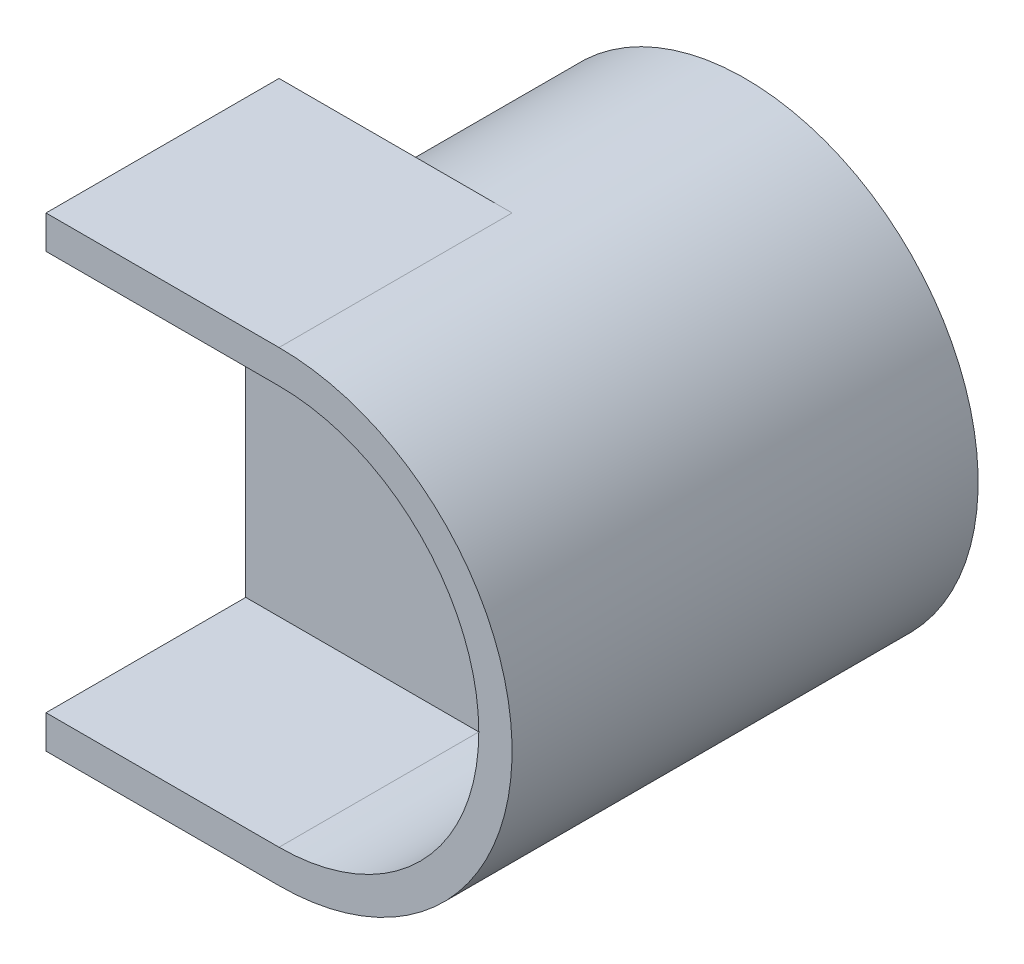
ISO-10303-21;
HEADER;
FILE_DESCRIPTION(('STEP AP214'),'2;1');
FILE_NAME('part.step','',(''),(''),'','','');
FILE_SCHEMA(('AUTOMOTIVE_DESIGN { 1 0 10303 214 1 1 1 1 }'));
ENDSEC;
DATA;
#1=APPLICATION_CONTEXT('core data for automotive mechanical design processes');
#2=APPLICATION_PROTOCOL_DEFINITION('international standard','automotive_design',2000,#1);
#3=PRODUCT_CONTEXT('',#1,'mechanical');
#4=PRODUCT('Part','Part','',(#3));
#5=PRODUCT_RELATED_PRODUCT_CATEGORY('part','',(#4));
#6=PRODUCT_DEFINITION_FORMATION('','',#4);
#7=PRODUCT_DEFINITION_CONTEXT('part definition',#1,'design');
#8=PRODUCT_DEFINITION('design','',#6,#7);
#9=PRODUCT_DEFINITION_SHAPE('','',#8);
#10=(LENGTH_UNIT() NAMED_UNIT(*) SI_UNIT(.MILLI.,.METRE.));
#11=(NAMED_UNIT(*) PLANE_ANGLE_UNIT() SI_UNIT($,.RADIAN.));
#12=(NAMED_UNIT(*) SI_UNIT($,.STERADIAN.) SOLID_ANGLE_UNIT());
#13=UNCERTAINTY_MEASURE_WITH_UNIT(LENGTH_MEASURE(1.E-05),#10,'distance_accuracy_value','');
#14=(GEOMETRIC_REPRESENTATION_CONTEXT(3) GLOBAL_UNCERTAINTY_ASSIGNED_CONTEXT((#13)) GLOBAL_UNIT_ASSIGNED_CONTEXT((#10,
#11,#12)) REPRESENTATION_CONTEXT('',''));
#15=CARTESIAN_POINT('',(0.,0.,0.));
#16=DIRECTION('',(0.,0.,1.));
#17=DIRECTION('',(1.,0.,0.));
#18=AXIS2_PLACEMENT_3D('',#15,#16,#17);
#19=CARTESIAN_POINT('',(0.,0.,-35.));
#20=DIRECTION('',(0.,0.,1.));
#21=DIRECTION('',(1.,0.,0.));
#22=AXIS2_PLACEMENT_3D('',#19,#20,#21);
#23=PLANE('',#22);
#24=DIRECTION('',(-1.,0.,0.));
#25=VECTOR('',#24,1.);
#26=CARTESIAN_POINT('',(35.,35.,-35.));
#27=LINE('',#26,#25);
#28=CARTESIAN_POINT('',(0.,35.,-35.));
#29=VERTEX_POINT('',#28);
#30=CARTESIAN_POINT('',(-35.,35.,-35.));
#31=VERTEX_POINT('',#30);
#32=EDGE_CURVE('E138',#29,#31,#27,.T.);
#33=ORIENTED_EDGE('',*,*,#32,.T.);
#34=DIRECTION('',(0.,-1.,0.));
#35=VECTOR('',#34,1.);
#36=CARTESIAN_POINT('',(-35.,-35.,-35.));
#37=LINE('',#36,#35);
#38=CARTESIAN_POINT('',(-35.,30.,-35.));
#39=VERTEX_POINT('',#38);
#40=EDGE_CURVE('E137',#31,#39,#37,.T.);
#41=ORIENTED_EDGE('',*,*,#40,.T.);
#42=DIRECTION('',(-1.,0.,0.));
#43=VECTOR('',#42,1.);
#44=CARTESIAN_POINT('',(35.,30.,-35.));
#45=LINE('',#44,#43);
#46=CARTESIAN_POINT('',(0.,30.,-35.));
#47=VERTEX_POINT('',#46);
#48=EDGE_CURVE('E65',#47,#39,#45,.T.);
#49=ORIENTED_EDGE('',*,*,#48,.F.);
#50=CARTESIAN_POINT('',(0.,0.,-35.));
#51=DIRECTION('',(0.,0.,1.));
#52=DIRECTION('',(1.,0.,0.));
#53=AXIS2_PLACEMENT_3D('',#50,#51,#52);
#54=CIRCLE('',#53,30.);
#55=CARTESIAN_POINT('',(0.,-30.,-35.));
#56=VERTEX_POINT('',#55);
#57=EDGE_CURVE('E143',#47,#56,#54,.F.);
#58=ORIENTED_EDGE('',*,*,#57,.T.);
#59=DIRECTION('',(1.,0.,0.));
#60=VECTOR('',#59,1.);
#61=CARTESIAN_POINT('',(0.,-30.,-35.));
#62=LINE('',#61,#60);
#63=CARTESIAN_POINT('',(-35.,-30.,-35.));
#64=VERTEX_POINT('',#63);
#65=EDGE_CURVE('E43',#56,#64,#62,.F.);
#66=ORIENTED_EDGE('',*,*,#65,.T.);
#67=CARTESIAN_POINT('',(-35.,-35.,-35.));
#68=VERTEX_POINT('',#67);
#69=EDGE_CURVE('E133',#64,#68,#37,.T.);
#70=ORIENTED_EDGE('',*,*,#69,.T.);
#71=DIRECTION('',(-1.,0.,0.));
#72=VECTOR('',#71,1.);
#73=CARTESIAN_POINT('',(35.,-35.,-35.));
#74=LINE('',#73,#72);
#75=CARTESIAN_POINT('',(0.,-35.,-35.));
#76=VERTEX_POINT('',#75);
#77=EDGE_CURVE('E88',#76,#68,#74,.T.);
#78=ORIENTED_EDGE('',*,*,#77,.F.);
#79=CARTESIAN_POINT('',(0.,0.,-35.));
#80=DIRECTION('',(0.,0.,1.));
#81=DIRECTION('',(1.,0.,0.));
#82=AXIS2_PLACEMENT_3D('',#79,#80,#81);
#83=CIRCLE('',#82,35.);
#84=EDGE_CURVE('E146',#29,#76,#83,.F.);
#85=ORIENTED_EDGE('',*,*,#84,.F.);
#86=EDGE_LOOP('',(#33,#41,#49,#58,#66,#70,#78,#85));
#87=FACE_BOUND('',#86,.T.);
#88=ADVANCED_FACE('F39',(#87),#23,.T.);
#89=CARTESIAN_POINT('',(0.,0.,-70.));
#90=DIRECTION('',(0.,0.,-1.));
#91=DIRECTION('',(-1.,0.,0.));
#92=AXIS2_PLACEMENT_3D('',#89,#90,#91);
#93=PLANE('',#92);
#94=CARTESIAN_POINT('',(0.,0.,-70.));
#95=DIRECTION('',(0.,0.,-1.));
#96=DIRECTION('',(-1.,0.,0.));
#97=AXIS2_PLACEMENT_3D('',#94,#95,#96);
#98=CIRCLE('',#97,17.5);
#99=CARTESIAN_POINT('',(-17.5,0.,-70.));
#100=VERTEX_POINT('',#99);
#101=EDGE_CURVE('E160',#100,#100,#98,.T.);
#102=ORIENTED_EDGE('',*,*,#101,.T.);
#103=EDGE_LOOP('',(#102));
#104=FACE_BOUND('',#103,.T.);
#105=ADVANCED_FACE('F230',(#104),#93,.T.);
#106=CARTESIAN_POINT('',(0.,0.,-105.));
#107=DIRECTION('',(0.,0.,1.));
#108=DIRECTION('',(1.,0.,0.));
#109=AXIS2_PLACEMENT_3D('',#106,#107,#108);
#110=CYLINDRICAL_SURFACE('',#109,17.5);
#111=CARTESIAN_POINT('',(0.,0.,-105.));
#112=DIRECTION('',(0.,0.,-1.));
#113=DIRECTION('',(-1.,0.,0.));
#114=AXIS2_PLACEMENT_3D('',#111,#112,#113);
#115=CIRCLE('',#114,17.5);
#116=CARTESIAN_POINT('',(-17.5,0.,-105.));
#117=VERTEX_POINT('',#116);
#118=EDGE_CURVE('E161',#117,#117,#115,.T.);
#119=ORIENTED_EDGE('',*,*,#118,.T.);
#120=EDGE_LOOP('',(#119));
#121=FACE_BOUND('',#120,.T.);
#122=ORIENTED_EDGE('',*,*,#101,.F.);
#123=EDGE_LOOP('',(#122));
#124=FACE_BOUND('',#123,.T.);
#125=ADVANCED_FACE('F232',(#121,#124),#110,.F.);
#126=CARTESIAN_POINT('',(6.19008791971696,-20.7170735549877,0.001000000000001));
#127=DIRECTION('',(0.,0.,-1.));
#128=DIRECTION('',(-1.,0.,0.));
#129=AXIS2_PLACEMENT_3D('',#126,#127,#128);
#130=CYLINDRICAL_SURFACE('',#129,2.5);
#131=CARTESIAN_POINT('',(6.19008791971696,-20.7170735549877,-65.));
#132=DIRECTION('',(0.,0.,-1.));
#133=DIRECTION('',(-1.,0.,0.));
#134=AXIS2_PLACEMENT_3D('',#131,#132,#133);
#135=CIRCLE('',#134,2.5);
#136=CARTESIAN_POINT('',(3.69008791971696,-20.7170735549877,-65.));
#137=VERTEX_POINT('',#136);
#138=EDGE_CURVE('E170',#137,#137,#135,.T.);
#139=ORIENTED_EDGE('',*,*,#138,.F.);
#140=EDGE_LOOP('',(#139));
#141=FACE_BOUND('',#140,.T.);
#142=CARTESIAN_POINT('',(6.19008791971696,-20.7170735549877,-105.));
#143=DIRECTION('',(0.,0.,-1.));
#144=DIRECTION('',(-1.,0.,0.));
#145=AXIS2_PLACEMENT_3D('',#142,#143,#144);
#146=CIRCLE('',#145,2.5);
#147=CARTESIAN_POINT('',(3.69008791971696,-20.7170735549877,-105.));
#148=VERTEX_POINT('',#147);
#149=EDGE_CURVE('E11',#148,#148,#146,.T.);
#150=ORIENTED_EDGE('',*,*,#149,.T.);
#151=EDGE_LOOP('',(#150));
#152=FACE_BOUND('',#151,.T.);
#153=ADVANCED_FACE('F41',(#141,#152),#130,.F.);
#154=CARTESIAN_POINT('',(21.5544566211452,-4.27973269928448,0.001000000000001));
#155=DIRECTION('',(0.,0.,-1.));
#156=DIRECTION('',(-1.,0.,0.));
#157=AXIS2_PLACEMENT_3D('',#154,#155,#156);
#158=CYLINDRICAL_SURFACE('',#157,2.5);
#159=CARTESIAN_POINT('',(21.5544566211452,-4.27973269928448,-65.));
#160=DIRECTION('',(0.,0.,-1.));
#161=DIRECTION('',(-1.,0.,0.));
#162=AXIS2_PLACEMENT_3D('',#159,#160,#161);
#163=CIRCLE('',#162,2.5);
#164=CARTESIAN_POINT('',(19.0544566211452,-4.27973269928448,-65.));
#165=VERTEX_POINT('',#164);
#166=EDGE_CURVE('E175',#165,#165,#163,.T.);
#167=ORIENTED_EDGE('',*,*,#166,.F.);
#168=EDGE_LOOP('',(#167));
#169=FACE_BOUND('',#168,.T.);
#170=CARTESIAN_POINT('',(21.5544566211452,-4.27973269928448,-105.));
#171=DIRECTION('',(0.,0.,-1.));
#172=DIRECTION('',(-1.,0.,0.));
#173=AXIS2_PLACEMENT_3D('',#170,#171,#172);
#174=CIRCLE('',#173,2.5);
#175=CARTESIAN_POINT('',(19.0544566211452,-4.27973269928448,-105.));
#176=VERTEX_POINT('',#175);
#177=EDGE_CURVE('E48',#176,#176,#174,.T.);
#178=ORIENTED_EDGE('',*,*,#177,.T.);
#179=EDGE_LOOP('',(#178));
#180=FACE_BOUND('',#179,.T.);
#181=ADVANCED_FACE('F263',(#169,#180),#158,.F.);
#182=CARTESIAN_POINT('',(15.0014862201565,17.2448713371146,0.001000000000001));
#183=DIRECTION('',(0.,0.,-1.));
#184=DIRECTION('',(-1.,0.,0.));
#185=AXIS2_PLACEMENT_3D('',#182,#183,#184);
#186=CYLINDRICAL_SURFACE('',#185,2.5);
#187=CARTESIAN_POINT('',(15.0014862201565,17.2448713371146,-65.));
#188=DIRECTION('',(0.,0.,-1.));
#189=DIRECTION('',(-1.,0.,0.));
#190=AXIS2_PLACEMENT_3D('',#187,#188,#189);
#191=CIRCLE('',#190,2.5);
#192=CARTESIAN_POINT('',(12.5014862201565,17.2448713371146,-65.));
#193=VERTEX_POINT('',#192);
#194=EDGE_CURVE('E152',#193,#193,#191,.T.);
#195=ORIENTED_EDGE('',*,*,#194,.F.);
#196=EDGE_LOOP('',(#195));
#197=FACE_BOUND('',#196,.T.);
#198=CARTESIAN_POINT('',(15.0014862201565,17.2448713371146,-105.));
#199=DIRECTION('',(0.,0.,-1.));
#200=DIRECTION('',(-1.,0.,0.));
#201=AXIS2_PLACEMENT_3D('',#198,#199,#200);
#202=CIRCLE('',#201,2.5);
#203=CARTESIAN_POINT('',(12.5014862201565,17.2448713371146,-105.));
#204=VERTEX_POINT('',#203);
#205=EDGE_CURVE('E157',#204,#204,#202,.T.);
#206=ORIENTED_EDGE('',*,*,#205,.T.);
#207=EDGE_LOOP('',(#206));
#208=FACE_BOUND('',#207,.T.);
#209=ADVANCED_FACE('F261',(#197,#208),#186,.F.);
#210=CARTESIAN_POINT('',(-35.,-35.,-70.));
#211=DIRECTION('',(1.,0.,0.));
#212=DIRECTION('',(0.,0.,-1.));
#213=AXIS2_PLACEMENT_3D('',#210,#211,#212);
#214=PLANE('',#213);
#215=ORIENTED_EDGE('',*,*,#40,.F.);
#216=DIRECTION('',(0.,0.,1.));
#217=VECTOR('',#216,1.);
#218=CARTESIAN_POINT('',(-35.,35.,-70.));
#219=LINE('',#218,#217);
#220=CARTESIAN_POINT('',(-35.,35.,-70.));
#221=VERTEX_POINT('',#220);
#222=EDGE_CURVE('E198',#221,#31,#219,.T.);
#223=ORIENTED_EDGE('',*,*,#222,.F.);
#224=DIRECTION('',(0.,1.,0.));
#225=VECTOR('',#224,1.);
#226=CARTESIAN_POINT('',(-35.,-35.,-70.));
#227=LINE('',#226,#225);
#228=CARTESIAN_POINT('',(-35.,0.,-70.));
#229=VERTEX_POINT('',#228);
#230=EDGE_CURVE('E192',#229,#221,#227,.T.);
#231=ORIENTED_EDGE('',*,*,#230,.F.);
#232=CARTESIAN_POINT('',(-35.,-35.,-70.));
#233=VERTEX_POINT('',#232);
#234=EDGE_CURVE('E56',#233,#229,#227,.T.);
#235=ORIENTED_EDGE('',*,*,#234,.F.);
#236=DIRECTION('',(0.,0.,1.));
#237=VECTOR('',#236,1.);
#238=CARTESIAN_POINT('',(-35.,-35.,-70.));
#239=LINE('',#238,#237);
#240=EDGE_CURVE('E136',#233,#68,#239,.T.);
#241=ORIENTED_EDGE('',*,*,#240,.T.);
#242=ORIENTED_EDGE('',*,*,#69,.F.);
#243=DIRECTION('',(0.,0.,1.));
#244=VECTOR('',#243,1.);
#245=CARTESIAN_POINT('',(-35.,-30.,-70.));
#246=LINE('',#245,#244);
#247=CARTESIAN_POINT('',(-35.,-30.,-65.));
#248=VERTEX_POINT('',#247);
#249=EDGE_CURVE('E120',#248,#64,#246,.T.);
#250=ORIENTED_EDGE('',*,*,#249,.F.);
#251=DIRECTION('',(0.,1.,0.));
#252=VECTOR('',#251,1.);
#253=CARTESIAN_POINT('',(-35.,-35.,-65.));
#254=LINE('',#253,#252);
#255=CARTESIAN_POINT('',(-35.,30.,-65.));
#256=VERTEX_POINT('',#255);
#257=EDGE_CURVE('E186',#248,#256,#254,.T.);
#258=ORIENTED_EDGE('',*,*,#257,.T.);
#259=DIRECTION('',(0.,0.,1.));
#260=VECTOR('',#259,1.);
#261=CARTESIAN_POINT('',(-35.,30.,-70.));
#262=LINE('',#261,#260);
#263=EDGE_CURVE('E129',#256,#39,#262,.T.);
#264=ORIENTED_EDGE('',*,*,#263,.T.);
#265=EDGE_LOOP('',(#215,#223,#231,#235,#241,#242,#250,#258,#264));
#266=FACE_BOUND('',#265,.T.);
#267=ADVANCED_FACE('F135',(#266),#214,.F.);
#268=CARTESIAN_POINT('',(0.,-30.,-70.));
#269=DIRECTION('',(0.,1.,0.));
#270=DIRECTION('',(0.,0.,1.));
#271=AXIS2_PLACEMENT_3D('',#268,#269,#270);
#272=PLANE('',#271);
#273=DIRECTION('',(0.,0.,1.));
#274=VECTOR('',#273,1.);
#275=CARTESIAN_POINT('',(0.,-30.,-70.));
#276=LINE('',#275,#274);
#277=CARTESIAN_POINT('',(0.,-30.,-65.));
#278=VERTEX_POINT('',#277);
#279=EDGE_CURVE('E130',#278,#56,#276,.T.);
#280=ORIENTED_EDGE('',*,*,#279,.F.);
#281=DIRECTION('',(-1.,0.,0.));
#282=VECTOR('',#281,1.);
#283=CARTESIAN_POINT('',(0.,-30.,-65.));
#284=LINE('',#283,#282);
#285=EDGE_CURVE('E125',#278,#248,#284,.T.);
#286=ORIENTED_EDGE('',*,*,#285,.T.);
#287=ORIENTED_EDGE('',*,*,#249,.T.);
#288=ORIENTED_EDGE('',*,*,#65,.F.);
#289=EDGE_LOOP('',(#280,#286,#287,#288));
#290=FACE_BOUND('',#289,.T.);
#291=ADVANCED_FACE('F123',(#290),#272,.T.);
#292=CARTESIAN_POINT('',(0.,0.,-65.));
#293=DIRECTION('',(0.,0.,-1.));
#294=DIRECTION('',(-1.,0.,0.));
#295=AXIS2_PLACEMENT_3D('',#292,#293,#294);
#296=PLANE('',#295);
#297=ORIENTED_EDGE('',*,*,#194,.T.);
#298=EDGE_LOOP('',(#297));
#299=FACE_BOUND('',#298,.T.);
#300=ORIENTED_EDGE('',*,*,#166,.T.);
#301=EDGE_LOOP('',(#300));
#302=FACE_BOUND('',#301,.T.);
#303=ORIENTED_EDGE('',*,*,#138,.T.);
#304=EDGE_LOOP('',(#303));
#305=FACE_BOUND('',#304,.T.);
#306=CARTESIAN_POINT('',(0.,0.,-65.));
#307=DIRECTION('',(0.,0.,-1.));
#308=DIRECTION('',(-1.,0.,0.));
#309=AXIS2_PLACEMENT_3D('',#306,#307,#308);
#310=CIRCLE('',#309,30.);
#311=CARTESIAN_POINT('',(0.,30.,-65.));
#312=VERTEX_POINT('',#311);
#313=EDGE_CURVE('E153',#312,#278,#310,.T.);
#314=ORIENTED_EDGE('',*,*,#313,.F.);
#315=DIRECTION('',(1.,0.,0.));
#316=VECTOR('',#315,1.);
#317=CARTESIAN_POINT('',(0.,30.,-65.));
#318=LINE('',#317,#316);
#319=EDGE_CURVE('E80',#256,#312,#318,.T.);
#320=ORIENTED_EDGE('',*,*,#319,.F.);
#321=ORIENTED_EDGE('',*,*,#257,.F.);
#322=ORIENTED_EDGE('',*,*,#285,.F.);
#323=EDGE_LOOP('',(#314,#320,#321,#322));
#324=FACE_BOUND('',#323,.T.);
#325=ADVANCED_FACE('F219',(#299,#302,#305,#324),#296,.F.);
#326=CARTESIAN_POINT('',(0.,30.,-70.));
#327=DIRECTION('',(0.,-1.,0.));
#328=DIRECTION('',(0.,0.,-1.));
#329=AXIS2_PLACEMENT_3D('',#326,#327,#328);
#330=PLANE('',#329);
#331=ORIENTED_EDGE('',*,*,#48,.T.);
#332=ORIENTED_EDGE('',*,*,#263,.F.);
#333=ORIENTED_EDGE('',*,*,#319,.T.);
#334=DIRECTION('',(0.,0.,1.));
#335=VECTOR('',#334,1.);
#336=CARTESIAN_POINT('',(0.,30.,-70.));
#337=LINE('',#336,#335);
#338=EDGE_CURVE('E180',#312,#47,#337,.T.);
#339=ORIENTED_EDGE('',*,*,#338,.T.);
#340=EDGE_LOOP('',(#331,#332,#333,#339));
#341=FACE_BOUND('',#340,.T.);
#342=ADVANCED_FACE('F217',(#341),#330,.T.);
#343=CARTESIAN_POINT('',(0.,0.,-70.));
#344=DIRECTION('',(0.,0.,1.));
#345=DIRECTION('',(1.,0.,0.));
#346=AXIS2_PLACEMENT_3D('',#343,#344,#345);
#347=CYLINDRICAL_SURFACE('',#346,30.);
#348=ORIENTED_EDGE('',*,*,#338,.F.);
#349=ORIENTED_EDGE('',*,*,#313,.T.);
#350=ORIENTED_EDGE('',*,*,#279,.T.);
#351=ORIENTED_EDGE('',*,*,#57,.F.);
#352=EDGE_LOOP('',(#348,#349,#350,#351));
#353=FACE_BOUND('',#352,.T.);
#354=ADVANCED_FACE('F215',(#353),#347,.F.);
#355=CARTESIAN_POINT('',(0.,0.,-105.));
#356=DIRECTION('',(0.,0.,-1.));
#357=DIRECTION('',(-1.,0.,0.));
#358=AXIS2_PLACEMENT_3D('',#355,#356,#357);
#359=PLANE('',#358);
#360=ORIENTED_EDGE('',*,*,#177,.F.);
#361=EDGE_LOOP('',(#360));
#362=FACE_BOUND('',#361,.T.);
#363=ORIENTED_EDGE('',*,*,#118,.F.);
#364=EDGE_LOOP('',(#363));
#365=FACE_BOUND('',#364,.T.);
#366=CARTESIAN_POINT('',(0.,0.,-105.));
#367=DIRECTION('',(0.,0.,-1.));
#368=DIRECTION('',(-1.,0.,0.));
#369=AXIS2_PLACEMENT_3D('',#366,#367,#368);
#370=CIRCLE('',#369,35.);
#371=CARTESIAN_POINT('',(-35.,0.,-105.));
#372=VERTEX_POINT('',#371);
#373=EDGE_CURVE('E167',#372,#372,#370,.T.);
#374=ORIENTED_EDGE('',*,*,#373,.T.);
#375=EDGE_LOOP('',(#374));
#376=FACE_BOUND('',#375,.T.);
#377=ORIENTED_EDGE('',*,*,#205,.F.);
#378=EDGE_LOOP('',(#377));
#379=FACE_BOUND('',#378,.T.);
#380=ORIENTED_EDGE('',*,*,#149,.F.);
#381=EDGE_LOOP('',(#380));
#382=FACE_BOUND('',#381,.T.);
#383=ADVANCED_FACE('F225',(#362,#365,#376,#379,#382),#359,.T.);
#384=CARTESIAN_POINT('',(0.,0.,-70.));
#385=DIRECTION('',(0.,0.,-1.));
#386=DIRECTION('',(-1.,0.,0.));
#387=AXIS2_PLACEMENT_3D('',#384,#385,#386);
#388=CIRCLE('',#387,35.);
#389=CARTESIAN_POINT('',(0.,35.,-70.));
#390=VERTEX_POINT('',#389);
#391=EDGE_CURVE('E164',#229,#390,#388,.T.);
#392=ORIENTED_EDGE('',*,*,#391,.F.);
#393=ORIENTED_EDGE('',*,*,#230,.T.);
#394=DIRECTION('',(1.,0.,0.));
#395=VECTOR('',#394,1.);
#396=CARTESIAN_POINT('',(0.,35.,-70.));
#397=LINE('',#396,#395);
#398=EDGE_CURVE('E194',#221,#390,#397,.T.);
#399=ORIENTED_EDGE('',*,*,#398,.T.);
#400=EDGE_LOOP('',(#392,#393,#399));
#401=FACE_BOUND('',#400,.T.);
#402=ADVANCED_FACE('F236',(#401),#93,.T.);
#403=CARTESIAN_POINT('',(0.,-35.,-70.));
#404=VERTEX_POINT('',#403);
#405=EDGE_CURVE('E149',#404,#229,#388,.T.);
#406=ORIENTED_EDGE('',*,*,#405,.F.);
#407=DIRECTION('',(-1.,0.,0.));
#408=VECTOR('',#407,1.);
#409=CARTESIAN_POINT('',(0.,-35.,-70.));
#410=LINE('',#409,#408);
#411=EDGE_CURVE('E151',#404,#233,#410,.T.);
#412=ORIENTED_EDGE('',*,*,#411,.T.);
#413=ORIENTED_EDGE('',*,*,#234,.T.);
#414=EDGE_LOOP('',(#406,#412,#413));
#415=FACE_BOUND('',#414,.T.);
#416=ADVANCED_FACE('F235',(#415),#93,.T.);
#417=CARTESIAN_POINT('',(0.,-35.,-70.));
#418=DIRECTION('',(0.,1.,0.));
#419=DIRECTION('',(0.,0.,1.));
#420=AXIS2_PLACEMENT_3D('',#417,#418,#419);
#421=PLANE('',#420);
#422=DIRECTION('',(0.,0.,1.));
#423=VECTOR('',#422,1.);
#424=CARTESIAN_POINT('',(0.,-35.,-70.));
#425=LINE('',#424,#423);
#426=EDGE_CURVE('E148',#404,#76,#425,.T.);
#427=ORIENTED_EDGE('',*,*,#426,.T.);
#428=ORIENTED_EDGE('',*,*,#77,.T.);
#429=ORIENTED_EDGE('',*,*,#240,.F.);
#430=ORIENTED_EDGE('',*,*,#411,.F.);
#431=EDGE_LOOP('',(#427,#428,#429,#430));
#432=FACE_BOUND('',#431,.T.);
#433=ADVANCED_FACE('F203',(#432),#421,.F.);
#434=CARTESIAN_POINT('',(0.,35.,-70.));
#435=DIRECTION('',(0.,-1.,0.));
#436=DIRECTION('',(0.,0.,-1.));
#437=AXIS2_PLACEMENT_3D('',#434,#435,#436);
#438=PLANE('',#437);
#439=ORIENTED_EDGE('',*,*,#32,.F.);
#440=DIRECTION('',(0.,0.,1.));
#441=VECTOR('',#440,1.);
#442=CARTESIAN_POINT('',(0.,35.,-70.));
#443=LINE('',#442,#441);
#444=EDGE_CURVE('E196',#390,#29,#443,.T.);
#445=ORIENTED_EDGE('',*,*,#444,.F.);
#446=ORIENTED_EDGE('',*,*,#398,.F.);
#447=ORIENTED_EDGE('',*,*,#222,.T.);
#448=EDGE_LOOP('',(#439,#445,#446,#447));
#449=FACE_BOUND('',#448,.T.);
#450=ADVANCED_FACE('F211',(#449),#438,.F.);
#451=CARTESIAN_POINT('',(0.,0.,-70.));
#452=DIRECTION('',(0.,0.,1.));
#453=DIRECTION('',(1.,0.,0.));
#454=AXIS2_PLACEMENT_3D('',#451,#452,#453);
#455=CYLINDRICAL_SURFACE('',#454,35.);
#456=ORIENTED_EDGE('',*,*,#444,.T.);
#457=ORIENTED_EDGE('',*,*,#84,.T.);
#458=ORIENTED_EDGE('',*,*,#426,.F.);
#459=ORIENTED_EDGE('',*,*,#405,.T.);
#460=ORIENTED_EDGE('',*,*,#391,.T.);
#461=EDGE_LOOP('',(#456,#457,#458,#459,#460));
#462=FACE_BOUND('',#461,.T.);
#463=ORIENTED_EDGE('',*,*,#373,.F.);
#464=EDGE_LOOP('',(#463));
#465=FACE_BOUND('',#464,.T.);
#466=ADVANCED_FACE('F206',(#462,#465),#455,.T.);
#467=CLOSED_SHELL('',(#88,#105,#125,#153,#181,#209,#267,#291,#325,#342,#354,#383,#402,#416,#433,
#450,#466));
#468=MANIFOLD_SOLID_BREP('B2',#467);
#469=ADVANCED_BREP_SHAPE_REPRESENTATION('',(#18,#468),#14);
#470=SHAPE_DEFINITION_REPRESENTATION(#9,#469);
ENDSEC;
END-ISO-10303-21;
